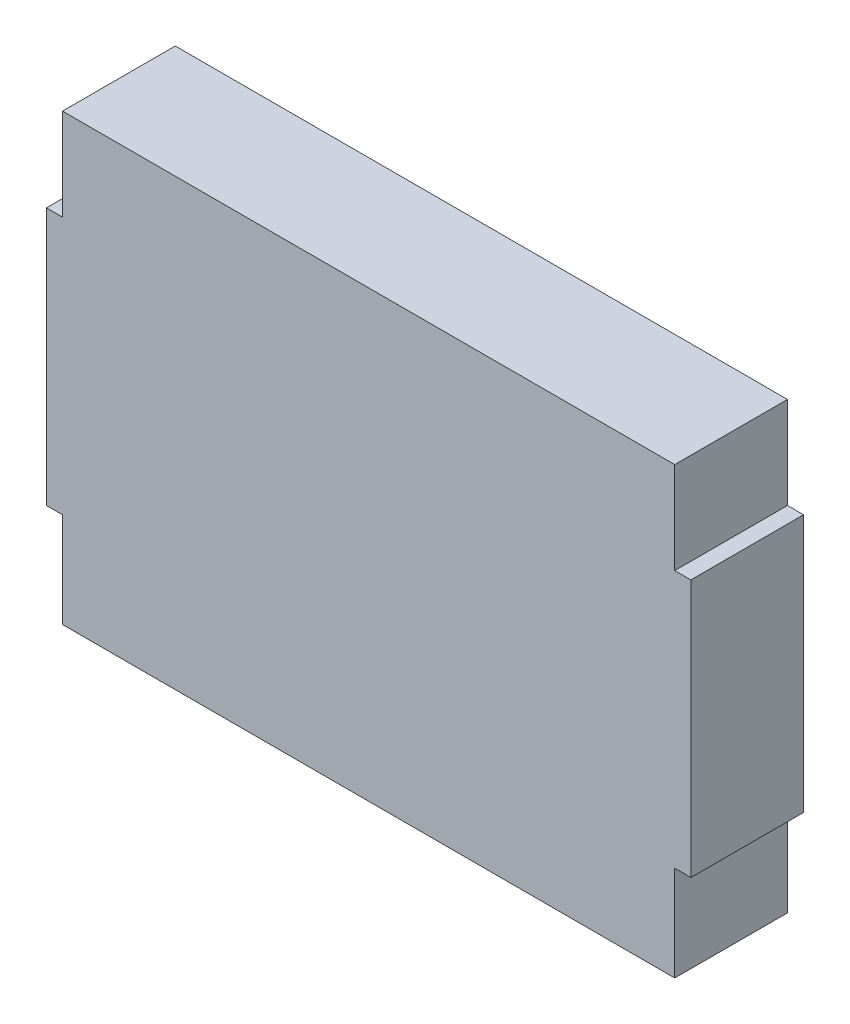
ISO-10303-21;
HEADER;
FILE_DESCRIPTION(('STEP AP214'),'2;1');
FILE_NAME('part.step','',(''),(''),'','','');
FILE_SCHEMA(('AUTOMOTIVE_DESIGN { 1 0 10303 214 1 1 1 1 }'));
ENDSEC;
DATA;
#1=APPLICATION_CONTEXT('core data for automotive mechanical design processes');
#2=APPLICATION_PROTOCOL_DEFINITION('international standard','automotive_design',2000,#1);
#3=PRODUCT_CONTEXT('',#1,'mechanical');
#4=PRODUCT('Part','Part','',(#3));
#5=PRODUCT_RELATED_PRODUCT_CATEGORY('part','',(#4));
#6=PRODUCT_DEFINITION_FORMATION('','',#4);
#7=PRODUCT_DEFINITION_CONTEXT('part definition',#1,'design');
#8=PRODUCT_DEFINITION('design','',#6,#7);
#9=PRODUCT_DEFINITION_SHAPE('','',#8);
#10=(LENGTH_UNIT() NAMED_UNIT(*) SI_UNIT(.MILLI.,.METRE.));
#11=(NAMED_UNIT(*) PLANE_ANGLE_UNIT() SI_UNIT($,.RADIAN.));
#12=(NAMED_UNIT(*) SI_UNIT($,.STERADIAN.) SOLID_ANGLE_UNIT());
#13=UNCERTAINTY_MEASURE_WITH_UNIT(LENGTH_MEASURE(1.E-05),#10,'distance_accuracy_value','');
#14=(GEOMETRIC_REPRESENTATION_CONTEXT(3) GLOBAL_UNCERTAINTY_ASSIGNED_CONTEXT((#13)) GLOBAL_UNIT_ASSIGNED_CONTEXT((#10,
#11,#12)) REPRESENTATION_CONTEXT('',''));
#15=CARTESIAN_POINT('',(0.,0.,0.));
#16=DIRECTION('',(0.,0.,1.));
#17=DIRECTION('',(1.,0.,0.));
#18=AXIS2_PLACEMENT_3D('',#15,#16,#17);
#19=CARTESIAN_POINT('',(4.745,-3.456,1.75));
#20=DIRECTION('',(0.,1.,0.));
#21=DIRECTION('',(0.,0.,1.));
#22=AXIS2_PLACEMENT_3D('',#19,#20,#21);
#23=PLANE('',#22);
#24=DIRECTION('',(1.,0.,0.));
#25=VECTOR('',#24,1.);
#26=CARTESIAN_POINT('',(4.745,-3.456,0.));
#27=LINE('',#26,#25);
#28=CARTESIAN_POINT('',(-4.755,-3.456,0.));
#29=VERTEX_POINT('',#28);
#30=CARTESIAN_POINT('',(4.745,-3.456,0.));
#31=VERTEX_POINT('',#30);
#32=EDGE_CURVE('E154',#29,#31,#27,.T.);
#33=ORIENTED_EDGE('',*,*,#32,.T.);
#34=DIRECTION('',(0.,0.,-1.));
#35=VECTOR('',#34,1.);
#36=CARTESIAN_POINT('',(4.745,-3.456,1.75));
#37=LINE('',#36,#35);
#38=CARTESIAN_POINT('',(4.745,-3.456,1.75));
#39=VERTEX_POINT('',#38);
#40=EDGE_CURVE('E11',#39,#31,#37,.T.);
#41=ORIENTED_EDGE('',*,*,#40,.F.);
#42=DIRECTION('',(1.,0.,0.));
#43=VECTOR('',#42,1.);
#44=CARTESIAN_POINT('',(4.745,-3.456,1.75));
#45=LINE('',#44,#43);
#46=CARTESIAN_POINT('',(-4.755,-3.456,1.75));
#47=VERTEX_POINT('',#46);
#48=EDGE_CURVE('E176',#47,#39,#45,.T.);
#49=ORIENTED_EDGE('',*,*,#48,.F.);
#50=DIRECTION('',(0.,0.,-1.));
#51=VECTOR('',#50,1.);
#52=CARTESIAN_POINT('',(-4.755,-3.456,1.75));
#53=LINE('',#52,#51);
#54=EDGE_CURVE('E150',#47,#29,#53,.T.);
#55=ORIENTED_EDGE('',*,*,#54,.T.);
#56=EDGE_LOOP('',(#33,#41,#49,#55));
#57=FACE_BOUND('',#56,.T.);
#58=ADVANCED_FACE('F34',(#57),#23,.F.);
#59=CARTESIAN_POINT('',(4.745,-1.981,1.75));
#60=DIRECTION('',(-1.,0.,0.));
#61=DIRECTION('',(0.,0.,1.));
#62=AXIS2_PLACEMENT_3D('',#59,#60,#61);
#63=PLANE('',#62);
#64=DIRECTION('',(0.,1.,0.));
#65=VECTOR('',#64,1.);
#66=CARTESIAN_POINT('',(4.745,-1.981,0.));
#67=LINE('',#66,#65);
#68=CARTESIAN_POINT('',(4.745,-1.981,0.));
#69=VERTEX_POINT('',#68);
#70=EDGE_CURVE('E157',#31,#69,#67,.T.);
#71=ORIENTED_EDGE('',*,*,#70,.T.);
#72=DIRECTION('',(0.,0.,-1.));
#73=VECTOR('',#72,1.);
#74=CARTESIAN_POINT('',(4.745,-1.981,1.75));
#75=LINE('',#74,#73);
#76=CARTESIAN_POINT('',(4.745,-1.981,1.75));
#77=VERTEX_POINT('',#76);
#78=EDGE_CURVE('E42',#77,#69,#75,.T.);
#79=ORIENTED_EDGE('',*,*,#78,.F.);
#80=DIRECTION('',(0.,1.,0.));
#81=VECTOR('',#80,1.);
#82=CARTESIAN_POINT('',(4.745,-1.981,1.75));
#83=LINE('',#82,#81);
#84=EDGE_CURVE('E105',#39,#77,#83,.T.);
#85=ORIENTED_EDGE('',*,*,#84,.F.);
#86=ORIENTED_EDGE('',*,*,#40,.T.);
#87=EDGE_LOOP('',(#71,#79,#85,#86));
#88=FACE_BOUND('',#87,.T.);
#89=ADVANCED_FACE('F254',(#88),#63,.F.);
#90=CARTESIAN_POINT('',(4.995,-1.981,1.75));
#91=DIRECTION('',(0.,1.,0.));
#92=DIRECTION('',(0.,0.,1.));
#93=AXIS2_PLACEMENT_3D('',#90,#91,#92);
#94=PLANE('',#93);
#95=DIRECTION('',(1.,0.,0.));
#96=VECTOR('',#95,1.);
#97=CARTESIAN_POINT('',(4.995,-1.981,0.));
#98=LINE('',#97,#96);
#99=CARTESIAN_POINT('',(4.995,-1.981,0.));
#100=VERTEX_POINT('',#99);
#101=EDGE_CURVE('E159',#69,#100,#98,.T.);
#102=ORIENTED_EDGE('',*,*,#101,.T.);
#103=DIRECTION('',(0.,0.,-1.));
#104=VECTOR('',#103,1.);
#105=CARTESIAN_POINT('',(4.995,-1.981,1.75));
#106=LINE('',#105,#104);
#107=CARTESIAN_POINT('',(4.995,-1.981,1.75));
#108=VERTEX_POINT('',#107);
#109=EDGE_CURVE('E195',#108,#100,#106,.T.);
#110=ORIENTED_EDGE('',*,*,#109,.F.);
#111=DIRECTION('',(1.,0.,0.));
#112=VECTOR('',#111,1.);
#113=CARTESIAN_POINT('',(4.995,-1.981,1.75));
#114=LINE('',#113,#112);
#115=EDGE_CURVE('E203',#77,#108,#114,.T.);
#116=ORIENTED_EDGE('',*,*,#115,.F.);
#117=ORIENTED_EDGE('',*,*,#78,.T.);
#118=EDGE_LOOP('',(#102,#110,#116,#117));
#119=FACE_BOUND('',#118,.T.);
#120=ADVANCED_FACE('F201',(#119),#94,.F.);
#121=CARTESIAN_POINT('',(4.995,2.019,1.75));
#122=DIRECTION('',(-1.,0.,0.));
#123=DIRECTION('',(0.,0.,1.));
#124=AXIS2_PLACEMENT_3D('',#121,#122,#123);
#125=PLANE('',#124);
#126=DIRECTION('',(0.,1.,0.));
#127=VECTOR('',#126,1.);
#128=CARTESIAN_POINT('',(4.995,2.019,0.));
#129=LINE('',#128,#127);
#130=CARTESIAN_POINT('',(4.995,2.019,0.));
#131=VERTEX_POINT('',#130);
#132=EDGE_CURVE('E161',#100,#131,#129,.T.);
#133=ORIENTED_EDGE('',*,*,#132,.T.);
#134=DIRECTION('',(0.,0.,-1.));
#135=VECTOR('',#134,1.);
#136=CARTESIAN_POINT('',(4.995,2.019,1.75));
#137=LINE('',#136,#135);
#138=CARTESIAN_POINT('',(4.995,2.019,1.75));
#139=VERTEX_POINT('',#138);
#140=EDGE_CURVE('E192',#139,#131,#137,.T.);
#141=ORIENTED_EDGE('',*,*,#140,.F.);
#142=DIRECTION('',(0.,1.,0.));
#143=VECTOR('',#142,1.);
#144=CARTESIAN_POINT('',(4.995,2.019,1.75));
#145=LINE('',#144,#143);
#146=EDGE_CURVE('E221',#108,#139,#145,.T.);
#147=ORIENTED_EDGE('',*,*,#146,.F.);
#148=ORIENTED_EDGE('',*,*,#109,.T.);
#149=EDGE_LOOP('',(#133,#141,#147,#148));
#150=FACE_BOUND('',#149,.T.);
#151=ADVANCED_FACE('F212',(#150),#125,.F.);
#152=CARTESIAN_POINT('',(4.745,2.019,1.75));
#153=DIRECTION('',(0.,-1.,0.));
#154=DIRECTION('',(0.,0.,-1.));
#155=AXIS2_PLACEMENT_3D('',#152,#153,#154);
#156=PLANE('',#155);
#157=DIRECTION('',(-1.,0.,0.));
#158=VECTOR('',#157,1.);
#159=CARTESIAN_POINT('',(4.745,2.019,0.));
#160=LINE('',#159,#158);
#161=CARTESIAN_POINT('',(4.745,2.019,0.));
#162=VERTEX_POINT('',#161);
#163=EDGE_CURVE('E163',#131,#162,#160,.T.);
#164=ORIENTED_EDGE('',*,*,#163,.T.);
#165=DIRECTION('',(0.,0.,-1.));
#166=VECTOR('',#165,1.);
#167=CARTESIAN_POINT('',(4.745,2.019,1.75));
#168=LINE('',#167,#166);
#169=CARTESIAN_POINT('',(4.745,2.019,1.75));
#170=VERTEX_POINT('',#169);
#171=EDGE_CURVE('E189',#170,#162,#168,.T.);
#172=ORIENTED_EDGE('',*,*,#171,.F.);
#173=DIRECTION('',(-1.,0.,0.));
#174=VECTOR('',#173,1.);
#175=CARTESIAN_POINT('',(4.745,2.019,1.75));
#176=LINE('',#175,#174);
#177=EDGE_CURVE('E218',#139,#170,#176,.T.);
#178=ORIENTED_EDGE('',*,*,#177,.F.);
#179=ORIENTED_EDGE('',*,*,#140,.T.);
#180=EDGE_LOOP('',(#164,#172,#178,#179));
#181=FACE_BOUND('',#180,.T.);
#182=ADVANCED_FACE('F216',(#181),#156,.F.);
#183=CARTESIAN_POINT('',(4.745,3.444,1.75));
#184=DIRECTION('',(-1.,0.,0.));
#185=DIRECTION('',(0.,0.,1.));
#186=AXIS2_PLACEMENT_3D('',#183,#184,#185);
#187=PLANE('',#186);
#188=DIRECTION('',(0.,1.,0.));
#189=VECTOR('',#188,1.);
#190=CARTESIAN_POINT('',(4.745,3.444,0.));
#191=LINE('',#190,#189);
#192=CARTESIAN_POINT('',(4.745,3.444,0.));
#193=VERTEX_POINT('',#192);
#194=EDGE_CURVE('E165',#162,#193,#191,.T.);
#195=ORIENTED_EDGE('',*,*,#194,.T.);
#196=DIRECTION('',(0.,0.,-1.));
#197=VECTOR('',#196,1.);
#198=CARTESIAN_POINT('',(4.745,3.444,1.75));
#199=LINE('',#198,#197);
#200=CARTESIAN_POINT('',(4.745,3.444,1.75));
#201=VERTEX_POINT('',#200);
#202=EDGE_CURVE('E186',#201,#193,#199,.T.);
#203=ORIENTED_EDGE('',*,*,#202,.F.);
#204=DIRECTION('',(0.,1.,0.));
#205=VECTOR('',#204,1.);
#206=CARTESIAN_POINT('',(4.745,3.444,1.75));
#207=LINE('',#206,#205);
#208=EDGE_CURVE('E220',#170,#201,#207,.T.);
#209=ORIENTED_EDGE('',*,*,#208,.F.);
#210=ORIENTED_EDGE('',*,*,#171,.T.);
#211=EDGE_LOOP('',(#195,#203,#209,#210));
#212=FACE_BOUND('',#211,.T.);
#213=ADVANCED_FACE('F267',(#212),#187,.F.);
#214=CARTESIAN_POINT('',(-4.755,3.444,1.75));
#215=DIRECTION('',(0.,-1.,0.));
#216=DIRECTION('',(0.,0.,-1.));
#217=AXIS2_PLACEMENT_3D('',#214,#215,#216);
#218=PLANE('',#217);
#219=DIRECTION('',(-1.,0.,0.));
#220=VECTOR('',#219,1.);
#221=CARTESIAN_POINT('',(-4.755,3.444,0.));
#222=LINE('',#221,#220);
#223=CARTESIAN_POINT('',(-4.755,3.444,0.));
#224=VERTEX_POINT('',#223);
#225=EDGE_CURVE('E167',#193,#224,#222,.T.);
#226=ORIENTED_EDGE('',*,*,#225,.T.);
#227=DIRECTION('',(0.,0.,-1.));
#228=VECTOR('',#227,1.);
#229=CARTESIAN_POINT('',(-4.755,3.444,1.75));
#230=LINE('',#229,#228);
#231=CARTESIAN_POINT('',(-4.755,3.444,1.75));
#232=VERTEX_POINT('',#231);
#233=EDGE_CURVE('E183',#232,#224,#230,.T.);
#234=ORIENTED_EDGE('',*,*,#233,.F.);
#235=DIRECTION('',(-1.,0.,0.));
#236=VECTOR('',#235,1.);
#237=CARTESIAN_POINT('',(-4.755,3.444,1.75));
#238=LINE('',#237,#236);
#239=EDGE_CURVE('E223',#201,#232,#238,.T.);
#240=ORIENTED_EDGE('',*,*,#239,.F.);
#241=ORIENTED_EDGE('',*,*,#202,.T.);
#242=EDGE_LOOP('',(#226,#234,#240,#241));
#243=FACE_BOUND('',#242,.T.);
#244=ADVANCED_FACE('F270',(#243),#218,.F.);
#245=CARTESIAN_POINT('',(-4.755,2.019,1.75));
#246=DIRECTION('',(1.,0.,0.));
#247=DIRECTION('',(0.,0.,-1.));
#248=AXIS2_PLACEMENT_3D('',#245,#246,#247);
#249=PLANE('',#248);
#250=DIRECTION('',(0.,-1.,0.));
#251=VECTOR('',#250,1.);
#252=CARTESIAN_POINT('',(-4.755,2.019,0.));
#253=LINE('',#252,#251);
#254=CARTESIAN_POINT('',(-4.755,2.019,0.));
#255=VERTEX_POINT('',#254);
#256=EDGE_CURVE('E169',#224,#255,#253,.T.);
#257=ORIENTED_EDGE('',*,*,#256,.T.);
#258=DIRECTION('',(0.,0.,-1.));
#259=VECTOR('',#258,1.);
#260=CARTESIAN_POINT('',(-4.755,2.019,1.75));
#261=LINE('',#260,#259);
#262=CARTESIAN_POINT('',(-4.755,2.019,1.75));
#263=VERTEX_POINT('',#262);
#264=EDGE_CURVE('E180',#263,#255,#261,.T.);
#265=ORIENTED_EDGE('',*,*,#264,.F.);
#266=DIRECTION('',(0.,-1.,0.));
#267=VECTOR('',#266,1.);
#268=CARTESIAN_POINT('',(-4.755,2.019,1.75));
#269=LINE('',#268,#267);
#270=EDGE_CURVE('E229',#232,#263,#269,.T.);
#271=ORIENTED_EDGE('',*,*,#270,.F.);
#272=ORIENTED_EDGE('',*,*,#233,.T.);
#273=EDGE_LOOP('',(#257,#265,#271,#272));
#274=FACE_BOUND('',#273,.T.);
#275=ADVANCED_FACE('F235',(#274),#249,.F.);
#276=CARTESIAN_POINT('',(-5.005,2.019,1.75));
#277=DIRECTION('',(0.,-1.,0.));
#278=DIRECTION('',(0.,0.,-1.));
#279=AXIS2_PLACEMENT_3D('',#276,#277,#278);
#280=PLANE('',#279);
#281=DIRECTION('',(-1.,0.,0.));
#282=VECTOR('',#281,1.);
#283=CARTESIAN_POINT('',(-5.005,2.019,0.));
#284=LINE('',#283,#282);
#285=CARTESIAN_POINT('',(-5.005,2.019,0.));
#286=VERTEX_POINT('',#285);
#287=EDGE_CURVE('E171',#255,#286,#284,.T.);
#288=ORIENTED_EDGE('',*,*,#287,.T.);
#289=DIRECTION('',(0.,0.,-1.));
#290=VECTOR('',#289,1.);
#291=CARTESIAN_POINT('',(-5.005,2.019,1.75));
#292=LINE('',#291,#290);
#293=CARTESIAN_POINT('',(-5.005,2.019,1.75));
#294=VERTEX_POINT('',#293);
#295=EDGE_CURVE('E145',#294,#286,#292,.T.);
#296=ORIENTED_EDGE('',*,*,#295,.F.);
#297=DIRECTION('',(-1.,0.,0.));
#298=VECTOR('',#297,1.);
#299=CARTESIAN_POINT('',(-5.005,2.019,1.75));
#300=LINE('',#299,#298);
#301=EDGE_CURVE('E136',#263,#294,#300,.T.);
#302=ORIENTED_EDGE('',*,*,#301,.F.);
#303=ORIENTED_EDGE('',*,*,#264,.T.);
#304=EDGE_LOOP('',(#288,#296,#302,#303));
#305=FACE_BOUND('',#304,.T.);
#306=ADVANCED_FACE('F239',(#305),#280,.F.);
#307=CARTESIAN_POINT('',(-5.005,-1.981,1.75));
#308=DIRECTION('',(1.,0.,0.));
#309=DIRECTION('',(0.,0.,-1.));
#310=AXIS2_PLACEMENT_3D('',#307,#308,#309);
#311=PLANE('',#310);
#312=DIRECTION('',(0.,-1.,0.));
#313=VECTOR('',#312,1.);
#314=CARTESIAN_POINT('',(-5.005,-1.981,0.));
#315=LINE('',#314,#313);
#316=CARTESIAN_POINT('',(-5.005,-1.981,0.));
#317=VERTEX_POINT('',#316);
#318=EDGE_CURVE('E144',#286,#317,#315,.T.);
#319=ORIENTED_EDGE('',*,*,#318,.T.);
#320=DIRECTION('',(0.,0.,-1.));
#321=VECTOR('',#320,1.);
#322=CARTESIAN_POINT('',(-5.005,-1.981,1.75));
#323=LINE('',#322,#321);
#324=CARTESIAN_POINT('',(-5.005,-1.981,1.75));
#325=VERTEX_POINT('',#324);
#326=EDGE_CURVE('E141',#325,#317,#323,.T.);
#327=ORIENTED_EDGE('',*,*,#326,.F.);
#328=DIRECTION('',(0.,-1.,0.));
#329=VECTOR('',#328,1.);
#330=CARTESIAN_POINT('',(-5.005,-1.981,1.75));
#331=LINE('',#330,#329);
#332=EDGE_CURVE('E130',#294,#325,#331,.T.);
#333=ORIENTED_EDGE('',*,*,#332,.F.);
#334=ORIENTED_EDGE('',*,*,#295,.T.);
#335=EDGE_LOOP('',(#319,#327,#333,#334));
#336=FACE_BOUND('',#335,.T.);
#337=ADVANCED_FACE('F142',(#336),#311,.F.);
#338=CARTESIAN_POINT('',(-4.755,-1.981,1.75));
#339=DIRECTION('',(0.,1.,0.));
#340=DIRECTION('',(0.,0.,1.));
#341=AXIS2_PLACEMENT_3D('',#338,#339,#340);
#342=PLANE('',#341);
#343=DIRECTION('',(1.,0.,0.));
#344=VECTOR('',#343,1.);
#345=CARTESIAN_POINT('',(-4.755,-1.981,0.));
#346=LINE('',#345,#344);
#347=CARTESIAN_POINT('',(-4.755,-1.981,0.));
#348=VERTEX_POINT('',#347);
#349=EDGE_CURVE('E91',#317,#348,#346,.T.);
#350=ORIENTED_EDGE('',*,*,#349,.T.);
#351=DIRECTION('',(0.,0.,-1.));
#352=VECTOR('',#351,1.);
#353=CARTESIAN_POINT('',(-4.755,-1.981,1.75));
#354=LINE('',#353,#352);
#355=CARTESIAN_POINT('',(-4.755,-1.981,1.75));
#356=VERTEX_POINT('',#355);
#357=EDGE_CURVE('E146',#356,#348,#354,.T.);
#358=ORIENTED_EDGE('',*,*,#357,.F.);
#359=DIRECTION('',(1.,0.,0.));
#360=VECTOR('',#359,1.);
#361=CARTESIAN_POINT('',(-4.755,-1.981,1.75));
#362=LINE('',#361,#360);
#363=EDGE_CURVE('E134',#325,#356,#362,.T.);
#364=ORIENTED_EDGE('',*,*,#363,.F.);
#365=ORIENTED_EDGE('',*,*,#326,.T.);
#366=EDGE_LOOP('',(#350,#358,#364,#365));
#367=FACE_BOUND('',#366,.T.);
#368=ADVANCED_FACE('F148',(#367),#342,.F.);
#369=CARTESIAN_POINT('',(-4.755,-3.456,1.75));
#370=DIRECTION('',(1.,0.,0.));
#371=DIRECTION('',(0.,0.,-1.));
#372=AXIS2_PLACEMENT_3D('',#369,#370,#371);
#373=PLANE('',#372);
#374=DIRECTION('',(0.,-1.,0.));
#375=VECTOR('',#374,1.);
#376=CARTESIAN_POINT('',(-4.755,-3.456,0.));
#377=LINE('',#376,#375);
#378=EDGE_CURVE('E97',#348,#29,#377,.T.);
#379=ORIENTED_EDGE('',*,*,#378,.T.);
#380=ORIENTED_EDGE('',*,*,#54,.F.);
#381=DIRECTION('',(0.,-1.,0.));
#382=VECTOR('',#381,1.);
#383=CARTESIAN_POINT('',(-4.755,-3.456,1.75));
#384=LINE('',#383,#382);
#385=EDGE_CURVE('E50',#356,#47,#384,.T.);
#386=ORIENTED_EDGE('',*,*,#385,.F.);
#387=ORIENTED_EDGE('',*,*,#357,.T.);
#388=EDGE_LOOP('',(#379,#380,#386,#387));
#389=FACE_BOUND('',#388,.T.);
#390=ADVANCED_FACE('F243',(#389),#373,.F.);
#391=CARTESIAN_POINT('',(0.,0.,1.75));
#392=DIRECTION('',(0.,0.,-1.));
#393=DIRECTION('',(-1.,0.,0.));
#394=AXIS2_PLACEMENT_3D('',#391,#392,#393);
#395=PLANE('',#394);
#396=ORIENTED_EDGE('',*,*,#48,.T.);
#397=ORIENTED_EDGE('',*,*,#84,.T.);
#398=ORIENTED_EDGE('',*,*,#115,.T.);
#399=ORIENTED_EDGE('',*,*,#146,.T.);
#400=ORIENTED_EDGE('',*,*,#177,.T.);
#401=ORIENTED_EDGE('',*,*,#208,.T.);
#402=ORIENTED_EDGE('',*,*,#239,.T.);
#403=ORIENTED_EDGE('',*,*,#270,.T.);
#404=ORIENTED_EDGE('',*,*,#301,.T.);
#405=ORIENTED_EDGE('',*,*,#332,.T.);
#406=ORIENTED_EDGE('',*,*,#363,.T.);
#407=ORIENTED_EDGE('',*,*,#385,.T.);
#408=EDGE_LOOP('',(#396,#397,#398,#399,#400,#401,#402,#403,#404,#405,#406,#407));
#409=FACE_BOUND('',#408,.T.);
#410=ADVANCED_FACE('F132',(#409),#395,.F.);
#411=CARTESIAN_POINT('',(0.,0.,0.));
#412=DIRECTION('',(0.,0.,-1.));
#413=DIRECTION('',(-1.,0.,0.));
#414=AXIS2_PLACEMENT_3D('',#411,#412,#413);
#415=PLANE('',#414);
#416=ORIENTED_EDGE('',*,*,#32,.F.);
#417=ORIENTED_EDGE('',*,*,#378,.F.);
#418=ORIENTED_EDGE('',*,*,#349,.F.);
#419=ORIENTED_EDGE('',*,*,#318,.F.);
#420=ORIENTED_EDGE('',*,*,#287,.F.);
#421=ORIENTED_EDGE('',*,*,#256,.F.);
#422=ORIENTED_EDGE('',*,*,#225,.F.);
#423=ORIENTED_EDGE('',*,*,#194,.F.);
#424=ORIENTED_EDGE('',*,*,#163,.F.);
#425=ORIENTED_EDGE('',*,*,#132,.F.);
#426=ORIENTED_EDGE('',*,*,#101,.F.);
#427=ORIENTED_EDGE('',*,*,#70,.F.);
#428=EDGE_LOOP('',(#416,#417,#418,#419,#420,#421,#422,#423,#424,#425,#426,#427));
#429=FACE_BOUND('',#428,.T.);
#430=ADVANCED_FACE('F207',(#429),#415,.T.);
#431=CLOSED_SHELL('',(#58,#89,#120,#151,#182,#213,#244,#275,#306,#337,#368,#390,#410,#430));
#432=MANIFOLD_SOLID_BREP('B2',#431);
#433=ADVANCED_BREP_SHAPE_REPRESENTATION('',(#18,#432),#14);
#434=SHAPE_DEFINITION_REPRESENTATION(#9,#433);
ENDSEC;
END-ISO-10303-21;
